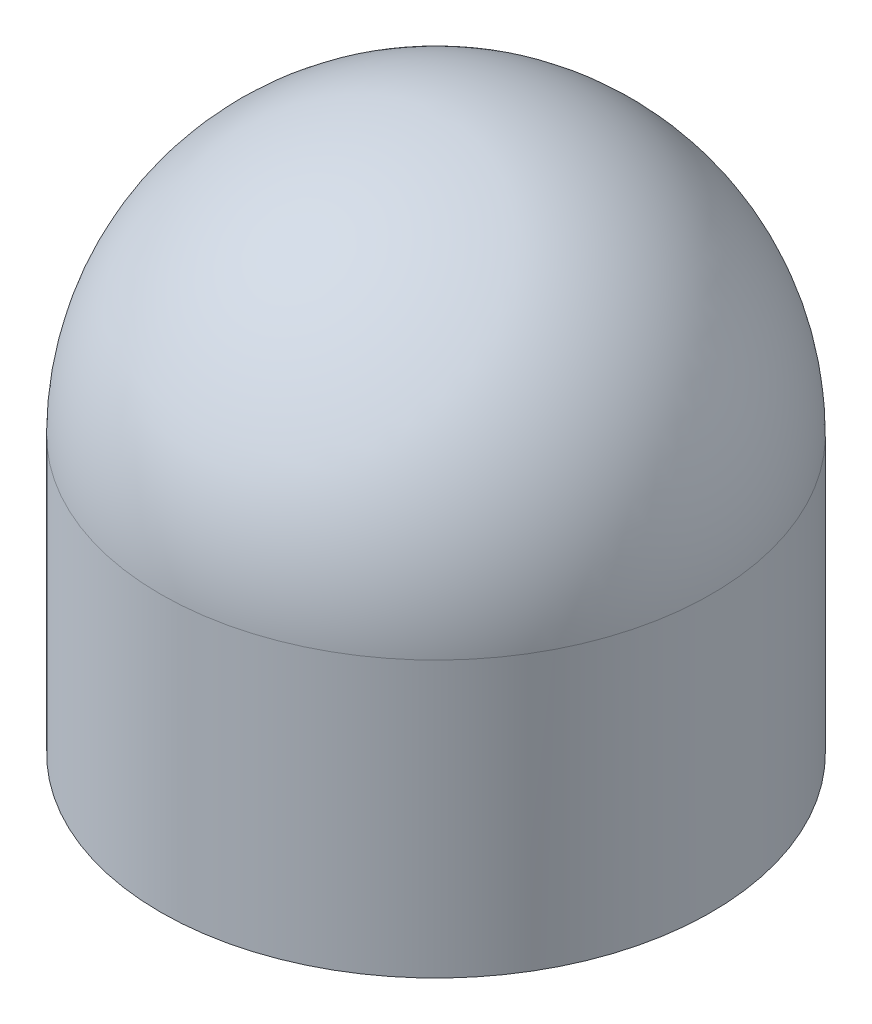
ISO-10303-21;
HEADER;
FILE_DESCRIPTION(('STEP AP214'),'2;1');
FILE_NAME('part.step','',(''),(''),'','','');
FILE_SCHEMA(('AUTOMOTIVE_DESIGN { 1 0 10303 214 1 1 1 1 }'));
ENDSEC;
DATA;
#1=APPLICATION_CONTEXT('core data for automotive mechanical design processes');
#2=APPLICATION_PROTOCOL_DEFINITION('international standard','automotive_design',2000,#1);
#3=PRODUCT_CONTEXT('',#1,'mechanical');
#4=PRODUCT('Part','Part','',(#3));
#5=PRODUCT_RELATED_PRODUCT_CATEGORY('part','',(#4));
#6=PRODUCT_DEFINITION_FORMATION('','',#4);
#7=PRODUCT_DEFINITION_CONTEXT('part definition',#1,'design');
#8=PRODUCT_DEFINITION('design','',#6,#7);
#9=PRODUCT_DEFINITION_SHAPE('','',#8);
#10=(LENGTH_UNIT() NAMED_UNIT(*) SI_UNIT(.MILLI.,.METRE.));
#11=(NAMED_UNIT(*) PLANE_ANGLE_UNIT() SI_UNIT($,.RADIAN.));
#12=(NAMED_UNIT(*) SI_UNIT($,.STERADIAN.) SOLID_ANGLE_UNIT());
#13=UNCERTAINTY_MEASURE_WITH_UNIT(LENGTH_MEASURE(1.E-05),#10,'distance_accuracy_value','');
#14=(GEOMETRIC_REPRESENTATION_CONTEXT(3) GLOBAL_UNCERTAINTY_ASSIGNED_CONTEXT((#13)) GLOBAL_UNIT_ASSIGNED_CONTEXT((#10,
#11,#12)) REPRESENTATION_CONTEXT('',''));
#15=CARTESIAN_POINT('',(0.,0.,0.));
#16=DIRECTION('',(0.,0.,1.));
#17=DIRECTION('',(1.,0.,0.));
#18=AXIS2_PLACEMENT_3D('',#15,#16,#17);
#19=CARTESIAN_POINT('',(0.,88.9,0.));
#20=DIRECTION('',(0.,1.,0.));
#21=DIRECTION('',(0.,0.,-1.));
#22=AXIS2_PLACEMENT_3D('',#19,#20,#21);
#23=SPHERICAL_SURFACE('',#22,88.9);
#24=CARTESIAN_POINT('',(0.,88.9,0.));
#25=DIRECTION('',(0.,1.,0.));
#26=DIRECTION('',(0.,0.,1.));
#27=AXIS2_PLACEMENT_3D('',#24,#25,#26);
#28=CIRCLE('',#27,88.9);
#29=CARTESIAN_POINT('',(0.,88.8999999999999,88.9));
#30=VERTEX_POINT('',#29);
#31=EDGE_CURVE('E45',#30,#30,#28,.T.);
#32=ORIENTED_EDGE('',*,*,#31,.T.);
#33=EDGE_LOOP('',(#32));
#34=FACE_BOUND('',#33,.T.);
#35=ADVANCED_FACE('F31',(#34),#23,.T.);
#36=CARTESIAN_POINT('',(0.,88.9,0.));
#37=DIRECTION('',(0.,1.,0.));
#38=DIRECTION('',(0.,0.,-1.));
#39=AXIS2_PLACEMENT_3D('',#36,#37,#38);
#40=SPHERICAL_SURFACE('',#39,82.55);
#41=CARTESIAN_POINT('',(0.,88.9,0.));
#42=DIRECTION('',(0.,1.,0.));
#43=DIRECTION('',(0.,0.,1.));
#44=AXIS2_PLACEMENT_3D('',#41,#42,#43);
#45=CIRCLE('',#44,82.55);
#46=CARTESIAN_POINT('',(0.,88.8999999999999,82.55));
#47=VERTEX_POINT('',#46);
#48=EDGE_CURVE('E10',#47,#47,#45,.T.);
#49=ORIENTED_EDGE('',*,*,#48,.F.);
#50=EDGE_LOOP('',(#49));
#51=FACE_BOUND('',#50,.T.);
#52=ADVANCED_FACE('F65',(#51),#40,.F.);
#53=CARTESIAN_POINT('',(0.,177.8,0.));
#54=DIRECTION('',(0.,1.,0.));
#55=DIRECTION('',(0.,0.,1.));
#56=AXIS2_PLACEMENT_3D('',#53,#54,#55);
#57=CYLINDRICAL_SURFACE('',#56,82.55);
#58=ORIENTED_EDGE('',*,*,#48,.T.);
#59=EDGE_LOOP('',(#58));
#60=FACE_BOUND('',#59,.T.);
#61=CARTESIAN_POINT('',(0.,0.,0.));
#62=DIRECTION('',(0.,1.,0.));
#63=DIRECTION('',(0.,0.,1.));
#64=AXIS2_PLACEMENT_3D('',#61,#62,#63);
#65=CIRCLE('',#64,82.55);
#66=CARTESIAN_POINT('',(0.,0.,82.55));
#67=VERTEX_POINT('',#66);
#68=EDGE_CURVE('E37',#67,#67,#65,.T.);
#69=ORIENTED_EDGE('',*,*,#68,.F.);
#70=EDGE_LOOP('',(#69));
#71=FACE_BOUND('',#70,.T.);
#72=ADVANCED_FACE('F60',(#60,#71),#57,.F.);
#73=CARTESIAN_POINT('',(0.,0.,-88.9));
#74=DIRECTION('',(0.,-1.,0.));
#75=DIRECTION('',(0.,0.,-1.));
#76=AXIS2_PLACEMENT_3D('',#73,#74,#75);
#77=PLANE('',#76);
#78=ORIENTED_EDGE('',*,*,#68,.T.);
#79=EDGE_LOOP('',(#78));
#80=FACE_BOUND('',#79,.T.);
#81=CARTESIAN_POINT('',(0.,0.,0.));
#82=DIRECTION('',(0.,1.,0.));
#83=DIRECTION('',(0.,0.,1.));
#84=AXIS2_PLACEMENT_3D('',#81,#82,#83);
#85=CIRCLE('',#84,88.9);
#86=CARTESIAN_POINT('',(0.,0.,88.9));
#87=VERTEX_POINT('',#86);
#88=EDGE_CURVE('E41',#87,#87,#85,.T.);
#89=ORIENTED_EDGE('',*,*,#88,.F.);
#90=EDGE_LOOP('',(#89));
#91=FACE_BOUND('',#90,.T.);
#92=ADVANCED_FACE('F55',(#80,#91),#77,.T.);
#93=CARTESIAN_POINT('',(0.,177.8,0.));
#94=DIRECTION('',(0.,1.,0.));
#95=DIRECTION('',(0.,0.,1.));
#96=AXIS2_PLACEMENT_3D('',#93,#94,#95);
#97=CYLINDRICAL_SURFACE('',#96,88.9);
#98=ORIENTED_EDGE('',*,*,#31,.F.);
#99=EDGE_LOOP('',(#98));
#100=FACE_BOUND('',#99,.T.);
#101=ORIENTED_EDGE('',*,*,#88,.T.);
#102=EDGE_LOOP('',(#101));
#103=FACE_BOUND('',#102,.T.);
#104=ADVANCED_FACE('F52',(#100,#103),#97,.T.);
#105=CLOSED_SHELL('',(#35,#52,#72,#92,#104));
#106=MANIFOLD_SOLID_BREP('B2',#105);
#107=ADVANCED_BREP_SHAPE_REPRESENTATION('',(#18,#106),#14);
#108=SHAPE_DEFINITION_REPRESENTATION(#9,#107);
ENDSEC;
END-ISO-10303-21;
